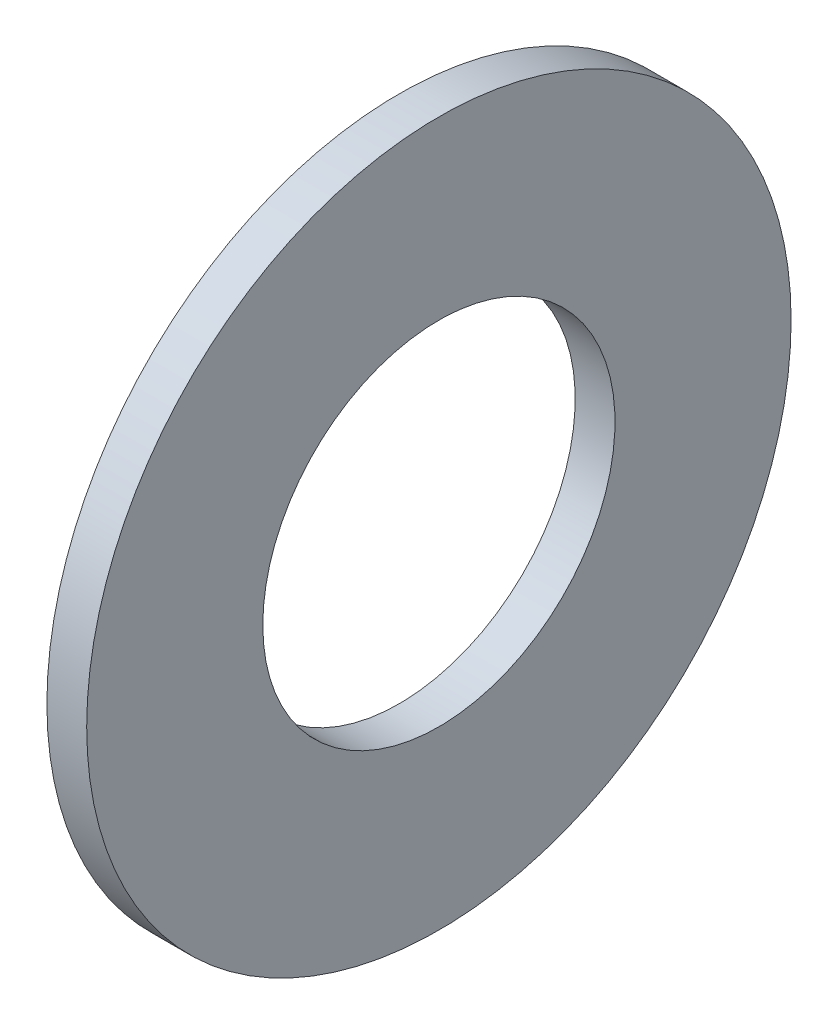
ISO-10303-21;
HEADER;
FILE_DESCRIPTION(('STEP AP214'),'2;1');
FILE_NAME('part.step','',(''),(''),'','','');
FILE_SCHEMA(('AUTOMOTIVE_DESIGN { 1 0 10303 214 1 1 1 1 }'));
ENDSEC;
DATA;
#1=APPLICATION_CONTEXT('core data for automotive mechanical design processes');
#2=APPLICATION_PROTOCOL_DEFINITION('international standard','automotive_design',2000,#1);
#3=PRODUCT_CONTEXT('',#1,'mechanical');
#4=PRODUCT('Part','Part','',(#3));
#5=PRODUCT_RELATED_PRODUCT_CATEGORY('part','',(#4));
#6=PRODUCT_DEFINITION_FORMATION('','',#4);
#7=PRODUCT_DEFINITION_CONTEXT('part definition',#1,'design');
#8=PRODUCT_DEFINITION('design','',#6,#7);
#9=PRODUCT_DEFINITION_SHAPE('','',#8);
#10=(LENGTH_UNIT() NAMED_UNIT(*) SI_UNIT(.MILLI.,.METRE.));
#11=(NAMED_UNIT(*) PLANE_ANGLE_UNIT() SI_UNIT($,.RADIAN.));
#12=(NAMED_UNIT(*) SI_UNIT($,.STERADIAN.) SOLID_ANGLE_UNIT());
#13=UNCERTAINTY_MEASURE_WITH_UNIT(LENGTH_MEASURE(1.E-05),#10,'distance_accuracy_value','');
#14=(GEOMETRIC_REPRESENTATION_CONTEXT(3) GLOBAL_UNCERTAINTY_ASSIGNED_CONTEXT((#13)) GLOBAL_UNIT_ASSIGNED_CONTEXT((#10,
#11,#12)) REPRESENTATION_CONTEXT('',''));
#15=CARTESIAN_POINT('',(0.,0.,0.));
#16=DIRECTION('',(0.,0.,1.));
#17=DIRECTION('',(1.,0.,0.));
#18=AXIS2_PLACEMENT_3D('',#15,#16,#17);
#19=CARTESIAN_POINT('',(1.524,0.,0.));
#20=DIRECTION('',(1.,0.,0.));
#21=DIRECTION('',(0.,0.,-1.));
#22=AXIS2_PLACEMENT_3D('',#19,#20,#21);
#23=PLANE('',#22);
#24=CARTESIAN_POINT('',(1.524,0.,0.));
#25=DIRECTION('',(1.,0.,0.));
#26=DIRECTION('',(0.,0.,-1.));
#27=AXIS2_PLACEMENT_3D('',#24,#25,#26);
#28=CIRCLE('',#27,13.4874);
#29=CARTESIAN_POINT('',(1.524,0.,13.4874));
#30=VERTEX_POINT('',#29);
#31=EDGE_CURVE('E10',#30,#30,#28,.T.);
#32=ORIENTED_EDGE('',*,*,#31,.T.);
#33=EDGE_LOOP('',(#32));
#34=FACE_BOUND('',#33,.T.);
#35=CARTESIAN_POINT('',(1.524,0.,0.));
#36=DIRECTION('',(1.,0.,0.));
#37=DIRECTION('',(0.,0.,-1.));
#38=AXIS2_PLACEMENT_3D('',#35,#36,#37);
#39=CIRCLE('',#38,6.7437);
#40=CARTESIAN_POINT('',(1.524,0.,6.7437));
#41=VERTEX_POINT('',#40);
#42=EDGE_CURVE('E41',#41,#41,#39,.T.);
#43=ORIENTED_EDGE('',*,*,#42,.F.);
#44=EDGE_LOOP('',(#43));
#45=FACE_BOUND('',#44,.T.);
#46=ADVANCED_FACE('F30',(#34,#45),#23,.T.);
#47=CARTESIAN_POINT('',(0.,0.,0.));
#48=DIRECTION('',(1.,0.,0.));
#49=DIRECTION('',(0.,0.,-1.));
#50=AXIS2_PLACEMENT_3D('',#47,#48,#49);
#51=PLANE('',#50);
#52=CARTESIAN_POINT('',(0.,0.,0.));
#53=DIRECTION('',(1.,0.,0.));
#54=DIRECTION('',(0.,0.,-1.));
#55=AXIS2_PLACEMENT_3D('',#52,#53,#54);
#56=CIRCLE('',#55,13.4874);
#57=CARTESIAN_POINT('',(0.,0.,13.4874));
#58=VERTEX_POINT('',#57);
#59=EDGE_CURVE('E34',#58,#58,#56,.T.);
#60=ORIENTED_EDGE('',*,*,#59,.F.);
#61=EDGE_LOOP('',(#60));
#62=FACE_BOUND('',#61,.T.);
#63=CARTESIAN_POINT('',(0.,0.,0.));
#64=DIRECTION('',(1.,0.,0.));
#65=DIRECTION('',(0.,0.,-1.));
#66=AXIS2_PLACEMENT_3D('',#63,#64,#65);
#67=CIRCLE('',#66,6.7437);
#68=CARTESIAN_POINT('',(0.,0.,6.7437));
#69=VERTEX_POINT('',#68);
#70=EDGE_CURVE('E43',#69,#69,#67,.T.);
#71=ORIENTED_EDGE('',*,*,#70,.T.);
#72=EDGE_LOOP('',(#71));
#73=FACE_BOUND('',#72,.T.);
#74=ADVANCED_FACE('F53',(#62,#73),#51,.F.);
#75=CARTESIAN_POINT('',(1.524,0.,0.));
#76=DIRECTION('',(-1.,0.,0.));
#77=DIRECTION('',(0.,0.,1.));
#78=AXIS2_PLACEMENT_3D('',#75,#76,#77);
#79=CYLINDRICAL_SURFACE('',#78,13.4874);
#80=CARTESIAN_POINT('',(1.524,0.,13.4874));
#81=CARTESIAN_POINT('',(1.508125,0.,13.4874));
#82=CARTESIAN_POINT('',(1.49225,0.,13.4874));
#83=CARTESIAN_POINT('',(1.4605,0.,13.4874));
#84=CARTESIAN_POINT('',(1.444625,0.,13.4874));
#85=CARTESIAN_POINT('',(1.412875,0.,13.4874));
#86=CARTESIAN_POINT('',(1.397,0.,13.4874));
#87=CARTESIAN_POINT('',(1.36525,0.,13.4874));
#88=CARTESIAN_POINT('',(1.349375,0.,13.4874));
#89=CARTESIAN_POINT('',(1.317625,0.,13.4874));
#90=CARTESIAN_POINT('',(1.30175,0.,13.4874));
#91=CARTESIAN_POINT('',(1.27,0.,13.4874));
#92=CARTESIAN_POINT('',(1.254125,0.,13.4874));
#93=CARTESIAN_POINT('',(1.222375,0.,13.4874));
#94=CARTESIAN_POINT('',(1.2065,0.,13.4874));
#95=CARTESIAN_POINT('',(1.17475,0.,13.4874));
#96=CARTESIAN_POINT('',(1.158875,0.,13.4874));
#97=CARTESIAN_POINT('',(1.127125,0.,13.4874));
#98=CARTESIAN_POINT('',(1.11125,0.,13.4874));
#99=CARTESIAN_POINT('',(1.0795,0.,13.4874));
#100=CARTESIAN_POINT('',(1.063625,0.,13.4874));
#101=CARTESIAN_POINT('',(1.031875,0.,13.4874));
#102=CARTESIAN_POINT('',(1.016,0.,13.4874));
#103=CARTESIAN_POINT('',(0.98425,0.,13.4874));
#104=CARTESIAN_POINT('',(0.968375,0.,13.4874));
#105=CARTESIAN_POINT('',(0.936625,0.,13.4874));
#106=CARTESIAN_POINT('',(0.92075,0.,13.4874));
#107=CARTESIAN_POINT('',(0.889,0.,13.4874));
#108=CARTESIAN_POINT('',(0.873125,0.,13.4874));
#109=CARTESIAN_POINT('',(0.841375,0.,13.4874));
#110=CARTESIAN_POINT('',(0.8255,0.,13.4874));
#111=CARTESIAN_POINT('',(0.79375,0.,13.4874));
#112=CARTESIAN_POINT('',(0.777875,0.,13.4874));
#113=CARTESIAN_POINT('',(0.746125,0.,13.4874));
#114=CARTESIAN_POINT('',(0.73025,0.,13.4874));
#115=CARTESIAN_POINT('',(0.6985,0.,13.4874));
#116=CARTESIAN_POINT('',(0.682625,0.,13.4874));
#117=CARTESIAN_POINT('',(0.650875,0.,13.4874));
#118=CARTESIAN_POINT('',(0.635,0.,13.4874));
#119=CARTESIAN_POINT('',(0.60325,0.,13.4874));
#120=CARTESIAN_POINT('',(0.587375,0.,13.4874));
#121=CARTESIAN_POINT('',(0.555625,0.,13.4874));
#122=CARTESIAN_POINT('',(0.53975,0.,13.4874));
#123=CARTESIAN_POINT('',(0.508,0.,13.4874));
#124=CARTESIAN_POINT('',(0.492125,0.,13.4874));
#125=CARTESIAN_POINT('',(0.460375,0.,13.4874));
#126=CARTESIAN_POINT('',(0.4445,0.,13.4874));
#127=CARTESIAN_POINT('',(0.41275,0.,13.4874));
#128=CARTESIAN_POINT('',(0.396875,0.,13.4874));
#129=CARTESIAN_POINT('',(0.365125,0.,13.4874));
#130=CARTESIAN_POINT('',(0.34925,0.,13.4874));
#131=CARTESIAN_POINT('',(0.3175,0.,13.4874));
#132=CARTESIAN_POINT('',(0.301625,0.,13.4874));
#133=CARTESIAN_POINT('',(0.269875,0.,13.4874));
#134=CARTESIAN_POINT('',(0.254,0.,13.4874));
#135=CARTESIAN_POINT('',(0.22225,0.,13.4874));
#136=CARTESIAN_POINT('',(0.206375,0.,13.4874));
#137=CARTESIAN_POINT('',(0.174625,0.,13.4874));
#138=CARTESIAN_POINT('',(0.15875,0.,13.4874));
#139=CARTESIAN_POINT('',(0.127,0.,13.4874));
#140=CARTESIAN_POINT('',(0.111125,0.,13.4874));
#141=CARTESIAN_POINT('',(0.079375,0.,13.4874));
#142=CARTESIAN_POINT('',(0.0635,0.,13.4874));
#143=CARTESIAN_POINT('',(0.0317499999999999,0.,13.4874));
#144=CARTESIAN_POINT('',(0.015875,0.,13.4874));
#145=CARTESIAN_POINT('',(0.,0.,13.4874));
#146=B_SPLINE_CURVE_WITH_KNOTS('',3,(#80,#81,#82,#83,#84,#85,#86,#87,#88,#89,#90,#91,#92,#93,
#94,#95,#96,#97,#98,#99,#100,#101,#102,#103,#104,#105,#106,#107,#108,#109,#110,#111,#112,#113,
#114,#115,#116,#117,#118,#119,#120,#121,#122,#123,#124,#125,#126,#127,#128,#129,#130,#131,#132,
#133,#134,#135,#136,#137,#138,#139,#140,#141,#142,#143,#144,#145),.UNSPECIFIED.,.F.,.F.,(4,2,2,
2,2,2,2,2,2,2,2,2,2,2,2,2,2,2,2,2,2,2,2,2,2,2,2,2,2,2,2,2,4),(0.,0.0476250000000001,
0.0952500000000001,0.142875,0.1905,0.238125,0.28575,0.333375,0.381,0.428625,0.47625,0.523875,
0.5715,0.619125,0.66675,0.714375,0.762,0.809625,0.85725,0.904875,0.9525,1.000125,1.04775,
1.095375,1.143,1.190625,1.23825,1.285875,1.3335,1.381125,1.42875,1.476375,1.524),.UNSPECIFIED.);
#147=EDGE_CURVE('BSEAM32',#30,#58,#146,.T.);
#148=ORIENTED_EDGE('',*,*,#31,.F.);
#149=ORIENTED_EDGE('',*,*,#59,.T.);
#150=ORIENTED_EDGE('',*,*,#147,.T.);
#151=ORIENTED_EDGE('',*,*,#147,.F.);
#152=EDGE_LOOP('',(#148,#150,#149,#151));
#153=FACE_BOUND('',#152,.T.);
#154=ADVANCED_FACE('F32',(#153),#79,.T.);
#155=CARTESIAN_POINT('',(1.524,0.,0.));
#156=DIRECTION('',(-1.,0.,0.));
#157=DIRECTION('',(0.,0.,1.));
#158=AXIS2_PLACEMENT_3D('',#155,#156,#157);
#159=CYLINDRICAL_SURFACE('',#158,6.7437);
#160=CARTESIAN_POINT('',(1.524,0.,6.7437));
#161=CARTESIAN_POINT('',(1.508125,0.,6.7437));
#162=CARTESIAN_POINT('',(1.49225,0.,6.7437));
#163=CARTESIAN_POINT('',(1.4605,0.,6.7437));
#164=CARTESIAN_POINT('',(1.444625,0.,6.7437));
#165=CARTESIAN_POINT('',(1.412875,0.,6.7437));
#166=CARTESIAN_POINT('',(1.397,0.,6.7437));
#167=CARTESIAN_POINT('',(1.36525,0.,6.7437));
#168=CARTESIAN_POINT('',(1.349375,0.,6.7437));
#169=CARTESIAN_POINT('',(1.317625,0.,6.7437));
#170=CARTESIAN_POINT('',(1.30175,0.,6.7437));
#171=CARTESIAN_POINT('',(1.27,0.,6.7437));
#172=CARTESIAN_POINT('',(1.254125,0.,6.7437));
#173=CARTESIAN_POINT('',(1.222375,0.,6.7437));
#174=CARTESIAN_POINT('',(1.2065,0.,6.7437));
#175=CARTESIAN_POINT('',(1.17475,0.,6.7437));
#176=CARTESIAN_POINT('',(1.158875,0.,6.7437));
#177=CARTESIAN_POINT('',(1.127125,0.,6.7437));
#178=CARTESIAN_POINT('',(1.11125,0.,6.7437));
#179=CARTESIAN_POINT('',(1.0795,0.,6.7437));
#180=CARTESIAN_POINT('',(1.063625,0.,6.7437));
#181=CARTESIAN_POINT('',(1.031875,0.,6.7437));
#182=CARTESIAN_POINT('',(1.016,0.,6.7437));
#183=CARTESIAN_POINT('',(0.98425,0.,6.7437));
#184=CARTESIAN_POINT('',(0.968375,0.,6.7437));
#185=CARTESIAN_POINT('',(0.936625,0.,6.7437));
#186=CARTESIAN_POINT('',(0.92075,0.,6.7437));
#187=CARTESIAN_POINT('',(0.889,0.,6.7437));
#188=CARTESIAN_POINT('',(0.873125,0.,6.7437));
#189=CARTESIAN_POINT('',(0.841375,0.,6.7437));
#190=CARTESIAN_POINT('',(0.8255,0.,6.7437));
#191=CARTESIAN_POINT('',(0.79375,0.,6.7437));
#192=CARTESIAN_POINT('',(0.777875,0.,6.7437));
#193=CARTESIAN_POINT('',(0.746125,0.,6.7437));
#194=CARTESIAN_POINT('',(0.73025,0.,6.7437));
#195=CARTESIAN_POINT('',(0.6985,0.,6.7437));
#196=CARTESIAN_POINT('',(0.682625,0.,6.7437));
#197=CARTESIAN_POINT('',(0.650875,0.,6.7437));
#198=CARTESIAN_POINT('',(0.635,0.,6.7437));
#199=CARTESIAN_POINT('',(0.60325,0.,6.7437));
#200=CARTESIAN_POINT('',(0.587375,0.,6.7437));
#201=CARTESIAN_POINT('',(0.555625,0.,6.7437));
#202=CARTESIAN_POINT('',(0.53975,0.,6.7437));
#203=CARTESIAN_POINT('',(0.508,0.,6.7437));
#204=CARTESIAN_POINT('',(0.492125,0.,6.7437));
#205=CARTESIAN_POINT('',(0.460375,0.,6.7437));
#206=CARTESIAN_POINT('',(0.4445,0.,6.7437));
#207=CARTESIAN_POINT('',(0.41275,0.,6.7437));
#208=CARTESIAN_POINT('',(0.396875,0.,6.7437));
#209=CARTESIAN_POINT('',(0.365125,0.,6.7437));
#210=CARTESIAN_POINT('',(0.34925,0.,6.7437));
#211=CARTESIAN_POINT('',(0.3175,0.,6.7437));
#212=CARTESIAN_POINT('',(0.301625,0.,6.7437));
#213=CARTESIAN_POINT('',(0.269875,0.,6.7437));
#214=CARTESIAN_POINT('',(0.254,0.,6.7437));
#215=CARTESIAN_POINT('',(0.22225,0.,6.7437));
#216=CARTESIAN_POINT('',(0.206375,0.,6.7437));
#217=CARTESIAN_POINT('',(0.174625,0.,6.7437));
#218=CARTESIAN_POINT('',(0.15875,0.,6.7437));
#219=CARTESIAN_POINT('',(0.127,0.,6.7437));
#220=CARTESIAN_POINT('',(0.111125,0.,6.7437));
#221=CARTESIAN_POINT('',(0.079375,0.,6.7437));
#222=CARTESIAN_POINT('',(0.0635,0.,6.7437));
#223=CARTESIAN_POINT('',(0.0317499999999999,0.,6.7437));
#224=CARTESIAN_POINT('',(0.015875,0.,6.7437));
#225=CARTESIAN_POINT('',(0.,0.,6.7437));
#226=B_SPLINE_CURVE_WITH_KNOTS('',3,(#160,#161,#162,#163,#164,#165,#166,#167,#168,#169,#170,
#171,#172,#173,#174,#175,#176,#177,#178,#179,#180,#181,#182,#183,#184,#185,#186,#187,#188,#189,
#190,#191,#192,#193,#194,#195,#196,#197,#198,#199,#200,#201,#202,#203,#204,#205,#206,#207,#208,
#209,#210,#211,#212,#213,#214,#215,#216,#217,#218,#219,#220,#221,#222,#223,#224,#225),
.UNSPECIFIED.,.F.,.F.,(4,2,2,2,2,2,2,2,2,2,2,2,2,2,2,2,2,2,2,2,2,2,2,2,2,2,2,2,2,2,2,2,4),(0.,
0.0476249999999999,0.0952499999999998,0.142875,0.1905,0.238125,0.28575,0.333375,0.381,0.428625,
0.47625,0.523875,0.5715,0.619125,0.66675,0.714375,0.762,0.809625,0.85725,0.904875,0.9525,
1.000125,1.04775,1.095375,1.143,1.190625,1.23825,1.285875,1.3335,1.381125,1.42875,1.476375,
1.524),.UNSPECIFIED.);
#227=EDGE_CURVE('BSEAM49',#41,#69,#226,.T.);
#228=ORIENTED_EDGE('',*,*,#42,.T.);
#229=ORIENTED_EDGE('',*,*,#70,.F.);
#230=ORIENTED_EDGE('',*,*,#227,.T.);
#231=ORIENTED_EDGE('',*,*,#227,.F.);
#232=EDGE_LOOP('',(#228,#230,#229,#231));
#233=FACE_BOUND('',#232,.T.);
#234=ADVANCED_FACE('F49',(#233),#159,.F.);
#235=CLOSED_SHELL('',(#46,#74,#154,#234));
#236=MANIFOLD_SOLID_BREP('B2',#235);
#237=ADVANCED_BREP_SHAPE_REPRESENTATION('',(#18,#236),#14);
#238=SHAPE_DEFINITION_REPRESENTATION(#9,#237);
ENDSEC;
END-ISO-10303-21;
